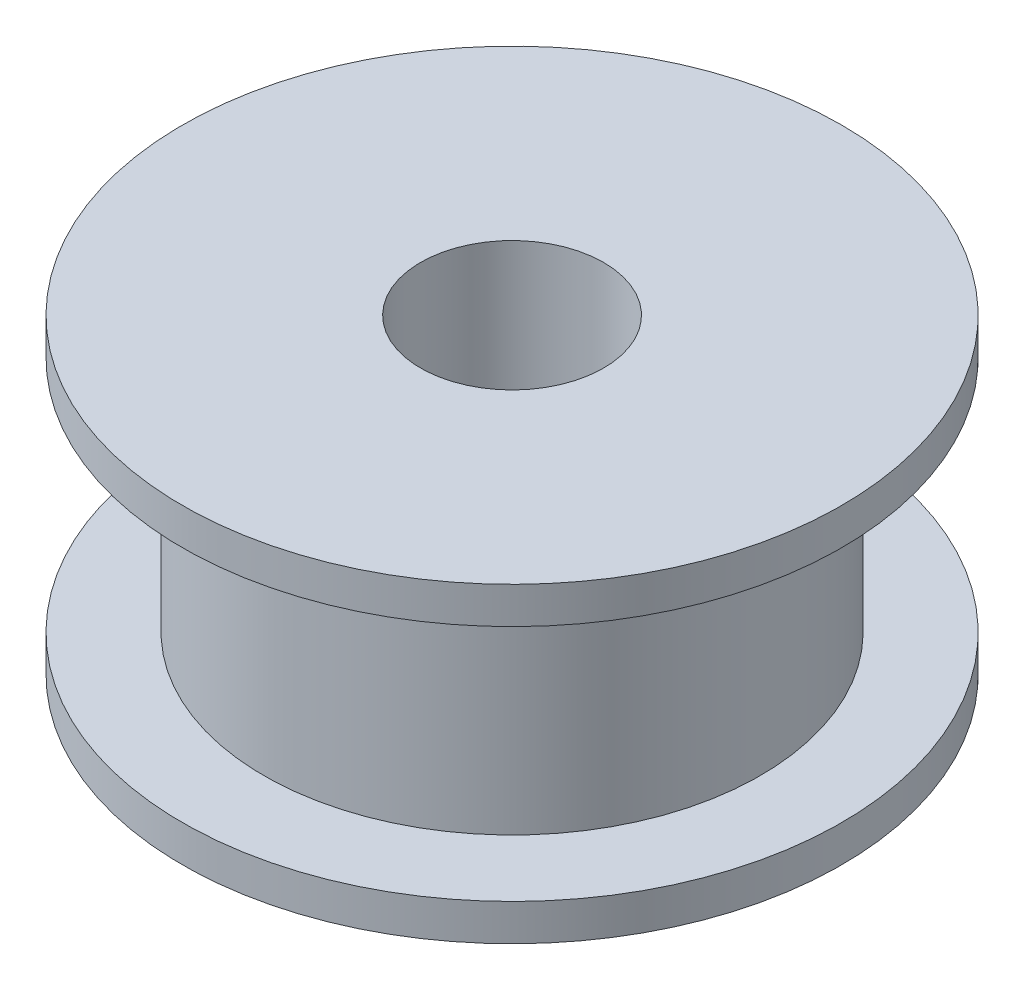
ISO-10303-21;
HEADER;
FILE_DESCRIPTION(('STEP AP214'),'2;1');
FILE_NAME('part.step','',(''),(''),'','','');
FILE_SCHEMA(('AUTOMOTIVE_DESIGN { 1 0 10303 214 1 1 1 1 }'));
ENDSEC;
DATA;
#1=APPLICATION_CONTEXT('core data for automotive mechanical design processes');
#2=APPLICATION_PROTOCOL_DEFINITION('international standard','automotive_design',2000,#1);
#3=PRODUCT_CONTEXT('',#1,'mechanical');
#4=PRODUCT('Part','Part','',(#3));
#5=PRODUCT_RELATED_PRODUCT_CATEGORY('part','',(#4));
#6=PRODUCT_DEFINITION_FORMATION('','',#4);
#7=PRODUCT_DEFINITION_CONTEXT('part definition',#1,'design');
#8=PRODUCT_DEFINITION('design','',#6,#7);
#9=PRODUCT_DEFINITION_SHAPE('','',#8);
#10=(LENGTH_UNIT() NAMED_UNIT(*) SI_UNIT(.MILLI.,.METRE.));
#11=(NAMED_UNIT(*) PLANE_ANGLE_UNIT() SI_UNIT($,.RADIAN.));
#12=(NAMED_UNIT(*) SI_UNIT($,.STERADIAN.) SOLID_ANGLE_UNIT());
#13=UNCERTAINTY_MEASURE_WITH_UNIT(LENGTH_MEASURE(1.E-05),#10,'distance_accuracy_value','');
#14=(GEOMETRIC_REPRESENTATION_CONTEXT(3) GLOBAL_UNCERTAINTY_ASSIGNED_CONTEXT((#13)) GLOBAL_UNIT_ASSIGNED_CONTEXT((#10,
#11,#12)) REPRESENTATION_CONTEXT('',''));
#15=CARTESIAN_POINT('',(0.,0.,0.));
#16=DIRECTION('',(0.,0.,1.));
#17=DIRECTION('',(1.,0.,0.));
#18=AXIS2_PLACEMENT_3D('',#15,#16,#17);
#19=CARTESIAN_POINT('',(0.,0.,0.));
#20=DIRECTION('',(0.,-1.,0.));
#21=DIRECTION('',(0.,0.,-1.));
#22=AXIS2_PLACEMENT_3D('',#19,#20,#21);
#23=CYLINDRICAL_SURFACE('',#22,2.5);
#24=CARTESIAN_POINT('',(0.,-4.25,0.));
#25=DIRECTION('',(0.,-1.,0.));
#26=DIRECTION('',(0.,0.,-1.));
#27=AXIS2_PLACEMENT_3D('',#24,#25,#26);
#28=CIRCLE('',#27,2.5);
#29=CARTESIAN_POINT('',(0.,-4.25,-2.5));
#30=VERTEX_POINT('',#29);
#31=EDGE_CURVE('E10',#30,#30,#28,.T.);
#32=ORIENTED_EDGE('',*,*,#31,.T.);
#33=EDGE_LOOP('',(#32));
#34=FACE_BOUND('',#33,.T.);
#35=CARTESIAN_POINT('',(0.,4.25,0.));
#36=DIRECTION('',(0.,-1.,0.));
#37=DIRECTION('',(0.,0.,-1.));
#38=AXIS2_PLACEMENT_3D('',#35,#36,#37);
#39=CIRCLE('',#38,2.5);
#40=CARTESIAN_POINT('',(0.,4.25,-2.5));
#41=VERTEX_POINT('',#40);
#42=EDGE_CURVE('E63',#41,#41,#39,.T.);
#43=ORIENTED_EDGE('',*,*,#42,.F.);
#44=EDGE_LOOP('',(#43));
#45=FACE_BOUND('',#44,.T.);
#46=ADVANCED_FACE('F35',(#34,#45),#23,.F.);
#47=CARTESIAN_POINT('',(2.5,-4.25,0.));
#48=DIRECTION('',(0.,-1.,0.));
#49=DIRECTION('',(0.,0.,-1.));
#50=AXIS2_PLACEMENT_3D('',#47,#48,#49);
#51=PLANE('',#50);
#52=CARTESIAN_POINT('',(0.,-4.25,0.));
#53=DIRECTION('',(0.,-1.,0.));
#54=DIRECTION('',(0.,0.,-1.));
#55=AXIS2_PLACEMENT_3D('',#52,#53,#54);
#56=CIRCLE('',#55,9.);
#57=CARTESIAN_POINT('',(0.,-4.25,-9.));
#58=VERTEX_POINT('',#57);
#59=EDGE_CURVE('E41',#58,#58,#56,.T.);
#60=ORIENTED_EDGE('',*,*,#59,.T.);
#61=EDGE_LOOP('',(#60));
#62=FACE_BOUND('',#61,.T.);
#63=ORIENTED_EDGE('',*,*,#31,.F.);
#64=EDGE_LOOP('',(#63));
#65=FACE_BOUND('',#64,.T.);
#66=ADVANCED_FACE('F71',(#62,#65),#51,.T.);
#67=CARTESIAN_POINT('',(0.,0.,0.));
#68=DIRECTION('',(0.,-1.,0.));
#69=DIRECTION('',(0.,0.,-1.));
#70=AXIS2_PLACEMENT_3D('',#67,#68,#69);
#71=CYLINDRICAL_SURFACE('',#70,9.);
#72=CARTESIAN_POINT('',(0.,-3.25,0.));
#73=DIRECTION('',(0.,-1.,0.));
#74=DIRECTION('',(0.,0.,-1.));
#75=AXIS2_PLACEMENT_3D('',#72,#73,#74);
#76=CIRCLE('',#75,9.);
#77=CARTESIAN_POINT('',(0.,-3.25,-9.));
#78=VERTEX_POINT('',#77);
#79=EDGE_CURVE('E45',#78,#78,#76,.T.);
#80=ORIENTED_EDGE('',*,*,#79,.T.);
#81=EDGE_LOOP('',(#80));
#82=FACE_BOUND('',#81,.T.);
#83=ORIENTED_EDGE('',*,*,#59,.F.);
#84=EDGE_LOOP('',(#83));
#85=FACE_BOUND('',#84,.T.);
#86=ADVANCED_FACE('F75',(#82,#85),#71,.T.);
#87=CARTESIAN_POINT('',(9.,-3.25,0.));
#88=DIRECTION('',(0.,1.,0.));
#89=DIRECTION('',(0.,0.,1.));
#90=AXIS2_PLACEMENT_3D('',#87,#88,#89);
#91=PLANE('',#90);
#92=CARTESIAN_POINT('',(0.,-3.25,0.));
#93=DIRECTION('',(0.,-1.,0.));
#94=DIRECTION('',(0.,0.,-1.));
#95=AXIS2_PLACEMENT_3D('',#92,#93,#94);
#96=CIRCLE('',#95,6.77782779545455);
#97=CARTESIAN_POINT('',(0.,-3.25,-6.77782779545455));
#98=VERTEX_POINT('',#97);
#99=EDGE_CURVE('E49',#98,#98,#96,.T.);
#100=ORIENTED_EDGE('',*,*,#99,.T.);
#101=EDGE_LOOP('',(#100));
#102=FACE_BOUND('',#101,.T.);
#103=ORIENTED_EDGE('',*,*,#79,.F.);
#104=EDGE_LOOP('',(#103));
#105=FACE_BOUND('',#104,.T.);
#106=ADVANCED_FACE('F79',(#102,#105),#91,.T.);
#107=CARTESIAN_POINT('',(0.,0.,0.));
#108=DIRECTION('',(0.,-1.,0.));
#109=DIRECTION('',(0.,0.,-1.));
#110=AXIS2_PLACEMENT_3D('',#107,#108,#109);
#111=CYLINDRICAL_SURFACE('',#110,6.77782779545455);
#112=CARTESIAN_POINT('',(0.,3.25,0.));
#113=DIRECTION('',(0.,-1.,0.));
#114=DIRECTION('',(0.,0.,-1.));
#115=AXIS2_PLACEMENT_3D('',#112,#113,#114);
#116=CIRCLE('',#115,6.77782779545455);
#117=CARTESIAN_POINT('',(0.,3.25,-6.77782779545455));
#118=VERTEX_POINT('',#117);
#119=EDGE_CURVE('E54',#118,#118,#116,.T.);
#120=ORIENTED_EDGE('',*,*,#119,.T.);
#121=EDGE_LOOP('',(#120));
#122=FACE_BOUND('',#121,.T.);
#123=ORIENTED_EDGE('',*,*,#99,.F.);
#124=EDGE_LOOP('',(#123));
#125=FACE_BOUND('',#124,.T.);
#126=ADVANCED_FACE('F86',(#122,#125),#111,.T.);
#127=CARTESIAN_POINT('',(9.,3.25,0.));
#128=DIRECTION('',(0.,-1.,0.));
#129=DIRECTION('',(0.,0.,-1.));
#130=AXIS2_PLACEMENT_3D('',#127,#128,#129);
#131=PLANE('',#130);
#132=CARTESIAN_POINT('',(0.,3.25,0.));
#133=DIRECTION('',(0.,-1.,0.));
#134=DIRECTION('',(0.,0.,-1.));
#135=AXIS2_PLACEMENT_3D('',#132,#133,#134);
#136=CIRCLE('',#135,9.);
#137=CARTESIAN_POINT('',(0.,3.25,-9.));
#138=VERTEX_POINT('',#137);
#139=EDGE_CURVE('E57',#138,#138,#136,.T.);
#140=ORIENTED_EDGE('',*,*,#139,.T.);
#141=EDGE_LOOP('',(#140));
#142=FACE_BOUND('',#141,.T.);
#143=ORIENTED_EDGE('',*,*,#119,.F.);
#144=EDGE_LOOP('',(#143));
#145=FACE_BOUND('',#144,.T.);
#146=ADVANCED_FACE('F90',(#142,#145),#131,.T.);
#147=CARTESIAN_POINT('',(0.,0.,0.));
#148=DIRECTION('',(0.,-1.,0.));
#149=DIRECTION('',(0.,0.,-1.));
#150=AXIS2_PLACEMENT_3D('',#147,#148,#149);
#151=CYLINDRICAL_SURFACE('',#150,9.);
#152=CARTESIAN_POINT('',(0.,4.25,0.));
#153=DIRECTION('',(0.,-1.,0.));
#154=DIRECTION('',(0.,0.,-1.));
#155=AXIS2_PLACEMENT_3D('',#152,#153,#154);
#156=CIRCLE('',#155,9.);
#157=CARTESIAN_POINT('',(0.,4.25,-9.));
#158=VERTEX_POINT('',#157);
#159=EDGE_CURVE('E60',#158,#158,#156,.T.);
#160=ORIENTED_EDGE('',*,*,#159,.T.);
#161=EDGE_LOOP('',(#160));
#162=FACE_BOUND('',#161,.T.);
#163=ORIENTED_EDGE('',*,*,#139,.F.);
#164=EDGE_LOOP('',(#163));
#165=FACE_BOUND('',#164,.T.);
#166=ADVANCED_FACE('F94',(#162,#165),#151,.T.);
#167=CARTESIAN_POINT('',(2.5,4.25,0.));
#168=DIRECTION('',(0.,1.,0.));
#169=DIRECTION('',(0.,0.,1.));
#170=AXIS2_PLACEMENT_3D('',#167,#168,#169);
#171=PLANE('',#170);
#172=ORIENTED_EDGE('',*,*,#42,.T.);
#173=EDGE_LOOP('',(#172));
#174=FACE_BOUND('',#173,.T.);
#175=ORIENTED_EDGE('',*,*,#159,.F.);
#176=EDGE_LOOP('',(#175));
#177=FACE_BOUND('',#176,.T.);
#178=ADVANCED_FACE('F67',(#174,#177),#171,.T.);
#179=CLOSED_SHELL('',(#46,#66,#86,#106,#126,#146,#166,#178));
#180=MANIFOLD_SOLID_BREP('B2',#179);
#181=ADVANCED_BREP_SHAPE_REPRESENTATION('',(#18,#180),#14);
#182=SHAPE_DEFINITION_REPRESENTATION(#9,#181);
ENDSEC;
END-ISO-10303-21;
